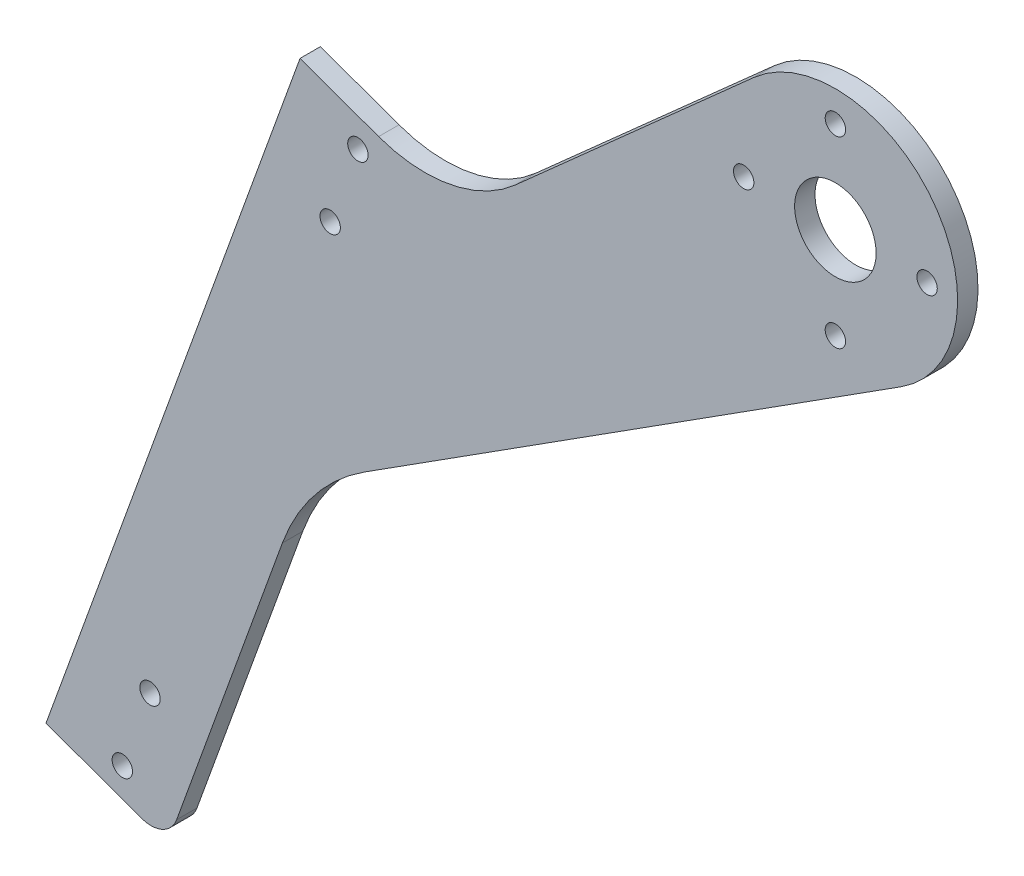
ISO-10303-21;
HEADER;
FILE_DESCRIPTION(('STEP AP214'),'2;1');
FILE_NAME('part.step','',(''),(''),'','','');
FILE_SCHEMA(('AUTOMOTIVE_DESIGN { 1 0 10303 214 1 1 1 1 }'));
ENDSEC;
DATA;
#1=APPLICATION_CONTEXT('core data for automotive mechanical design processes');
#2=APPLICATION_PROTOCOL_DEFINITION('international standard','automotive_design',2000,#1);
#3=PRODUCT_CONTEXT('',#1,'mechanical');
#4=PRODUCT('Part','Part','',(#3));
#5=PRODUCT_RELATED_PRODUCT_CATEGORY('part','',(#4));
#6=PRODUCT_DEFINITION_FORMATION('','',#4);
#7=PRODUCT_DEFINITION_CONTEXT('part definition',#1,'design');
#8=PRODUCT_DEFINITION('design','',#6,#7);
#9=PRODUCT_DEFINITION_SHAPE('','',#8);
#10=(LENGTH_UNIT() NAMED_UNIT(*) SI_UNIT(.MILLI.,.METRE.));
#11=(NAMED_UNIT(*) PLANE_ANGLE_UNIT() SI_UNIT($,.RADIAN.));
#12=(NAMED_UNIT(*) SI_UNIT($,.STERADIAN.) SOLID_ANGLE_UNIT());
#13=UNCERTAINTY_MEASURE_WITH_UNIT(LENGTH_MEASURE(1.E-05),#10,'distance_accuracy_value','');
#14=(GEOMETRIC_REPRESENTATION_CONTEXT(3) GLOBAL_UNCERTAINTY_ASSIGNED_CONTEXT((#13)) GLOBAL_UNIT_ASSIGNED_CONTEXT((#10,
#11,#12)) REPRESENTATION_CONTEXT('',''));
#15=CARTESIAN_POINT('',(0.,0.,0.));
#16=DIRECTION('',(0.,0.,1.));
#17=DIRECTION('',(1.,0.,0.));
#18=AXIS2_PLACEMENT_3D('',#15,#16,#17);
#19=CARTESIAN_POINT('',(2503.44317383467,1688.92255844548,3.));
#20=DIRECTION('',(0.,0.,-1.));
#21=DIRECTION('',(-1.,0.,0.));
#22=AXIS2_PLACEMENT_3D('',#19,#20,#21);
#23=CYLINDRICAL_SURFACE('',#22,29.9999999999998);
#24=CARTESIAN_POINT('',(2503.44317383467,1688.92255844548,0.));
#25=DIRECTION('',(0.,0.,1.));
#26=DIRECTION('',(1.,0.,0.));
#27=AXIS2_PLACEMENT_3D('',#24,#25,#26);
#28=CIRCLE('',#27,29.9999999999998);
#29=CARTESIAN_POINT('',(2487.3154468752,1714.21873252618,0.));
#30=VERTEX_POINT('',#29);
#31=CARTESIAN_POINT('',(2475.23009416642,1699.12168270361,0.));
#32=VERTEX_POINT('',#31);
#33=EDGE_CURVE('E169',#30,#32,#28,.T.);
#34=ORIENTED_EDGE('',*,*,#33,.F.);
#35=DIRECTION('',(0.,0.,-1.));
#36=VECTOR('',#35,1.);
#37=CARTESIAN_POINT('',(2487.3154468752,1714.21873252618,3.));
#38=LINE('',#37,#36);
#39=CARTESIAN_POINT('',(2487.3154468752,1714.21873252618,3.));
#40=VERTEX_POINT('',#39);
#41=EDGE_CURVE('E11',#40,#30,#38,.T.);
#42=ORIENTED_EDGE('',*,*,#41,.F.);
#43=CARTESIAN_POINT('',(2503.44317383467,1688.92255844548,3.));
#44=DIRECTION('',(0.,0.,1.));
#45=DIRECTION('',(1.,0.,0.));
#46=AXIS2_PLACEMENT_3D('',#43,#44,#45);
#47=CIRCLE('',#46,29.9999999999998);
#48=CARTESIAN_POINT('',(2475.23009416642,1699.12168270361,3.));
#49=VERTEX_POINT('',#48);
#50=EDGE_CURVE('E484',#40,#49,#47,.T.);
#51=ORIENTED_EDGE('',*,*,#50,.T.);
#52=DIRECTION('',(0.,0.,-1.));
#53=VECTOR('',#52,1.);
#54=CARTESIAN_POINT('',(2475.23009416642,1699.12168270361,3.));
#55=LINE('',#54,#53);
#56=EDGE_CURVE('E49',#49,#32,#55,.T.);
#57=ORIENTED_EDGE('',*,*,#56,.T.);
#58=EDGE_LOOP('',(#34,#42,#51,#57));
#59=FACE_BOUND('',#58,.T.);
#60=ADVANCED_FACE('F32',(#59),#23,.F.);
#61=CARTESIAN_POINT('',(-58.2108994697482,91.3031979076545,3.));
#62=DIRECTION('',(-0.537590898648854,0.8432058026899,0.));
#63=DIRECTION('',(-0.8432058026899,-0.537590898648854,0.));
#64=AXIS2_PLACEMENT_3D('',#61,#62,#63);
#65=PLANE('',#64);
#66=DIRECTION('',(0.8432058026899,0.537590898648854,0.));
#67=VECTOR('',#66,1.);
#68=CARTESIAN_POINT('',(-58.2108994697482,91.3031979076545,0.));
#69=LINE('',#68,#67);
#70=CARTESIAN_POINT('',(2566.31304572621,1764.58412377697,0.));
#71=VERTEX_POINT('',#70);
#72=EDGE_CURVE('E171',#30,#71,#69,.T.);
#73=ORIENTED_EDGE('',*,*,#72,.T.);
#74=DIRECTION('',(0.,0.,-1.));
#75=VECTOR('',#74,1.);
#76=CARTESIAN_POINT('',(2566.31304572621,1764.58412377697,3.));
#77=LINE('',#76,#75);
#78=CARTESIAN_POINT('',(2566.31304572621,1764.58412377697,3.));
#79=VERTEX_POINT('',#78);
#80=EDGE_CURVE('E41',#79,#71,#77,.T.);
#81=ORIENTED_EDGE('',*,*,#80,.F.);
#82=DIRECTION('',(0.8432058026899,0.537590898648854,0.));
#83=VECTOR('',#82,1.);
#84=CARTESIAN_POINT('',(-58.2108994697482,91.3031979076545,3.));
#85=LINE('',#84,#83);
#86=EDGE_CURVE('E482',#40,#79,#85,.T.);
#87=ORIENTED_EDGE('',*,*,#86,.F.);
#88=ORIENTED_EDGE('',*,*,#41,.T.);
#89=EDGE_LOOP('',(#73,#81,#87,#88));
#90=FACE_BOUND('',#89,.T.);
#91=ADVANCED_FACE('F227',(#90),#65,.F.);
#92=CARTESIAN_POINT('',(2556.63640955053,1779.76182822538,3.));
#93=DIRECTION('',(0.,0.,-1.));
#94=DIRECTION('',(-1.,0.,0.));
#95=AXIS2_PLACEMENT_3D('',#92,#93,#94);
#96=CYLINDRICAL_SURFACE('',#95,17.9999999999997);
#97=CARTESIAN_POINT('',(2556.63640955053,1779.76182822538,0.));
#98=DIRECTION('',(0.,0.,1.));
#99=DIRECTION('',(1.,0.,0.));
#100=AXIS2_PLACEMENT_3D('',#97,#98,#99);
#101=CIRCLE('',#100,17.9999999999997);
#102=CARTESIAN_POINT('',(2544.66757116968,1793.20604288497,0.));
#103=VERTEX_POINT('',#102);
#104=EDGE_CURVE('E174',#71,#103,#101,.T.);
#105=ORIENTED_EDGE('',*,*,#104,.T.);
#106=DIRECTION('',(0.,0.,-1.));
#107=VECTOR('',#106,1.);
#108=CARTESIAN_POINT('',(2544.66757116968,1793.20604288497,3.));
#109=LINE('',#108,#107);
#110=CARTESIAN_POINT('',(2544.66757116968,1793.20604288497,3.));
#111=VERTEX_POINT('',#110);
#112=EDGE_CURVE('E217',#111,#103,#109,.T.);
#113=ORIENTED_EDGE('',*,*,#112,.F.);
#114=CARTESIAN_POINT('',(2556.63640955053,1779.76182822538,3.));
#115=DIRECTION('',(0.,0.,1.));
#116=DIRECTION('',(1.,0.,0.));
#117=AXIS2_PLACEMENT_3D('',#114,#115,#116);
#118=CIRCLE('',#117,17.9999999999997);
#119=EDGE_CURVE('E223',#79,#111,#118,.T.);
#120=ORIENTED_EDGE('',*,*,#119,.F.);
#121=ORIENTED_EDGE('',*,*,#80,.T.);
#122=EDGE_LOOP('',(#105,#113,#120,#121));
#123=FACE_BOUND('',#122,.T.);
#124=ADVANCED_FACE('F221',(#123),#96,.T.);
#125=CARTESIAN_POINT('',(234.517859676913,-263.426436774984,3.));
#126=DIRECTION('',(-0.664935465602856,0.746900814421509,0.));
#127=DIRECTION('',(-0.746900814421509,-0.664935465602856,0.));
#128=AXIS2_PLACEMENT_3D('',#125,#126,#127);
#129=PLANE('',#128);
#130=DIRECTION('',(0.746900814421509,0.664935465602856,0.));
#131=VECTOR('',#130,1.);
#132=CARTESIAN_POINT('',(234.517859676913,-263.426436774984,0.));
#133=LINE('',#132,#131);
#134=CARTESIAN_POINT('',(2509.49964392501,1761.8974653266,0.));
#135=VERTEX_POINT('',#134);
#136=EDGE_CURVE('E177',#135,#103,#133,.T.);
#137=ORIENTED_EDGE('',*,*,#136,.F.);
#138=DIRECTION('',(0.,0.,-1.));
#139=VECTOR('',#138,1.);
#140=CARTESIAN_POINT('',(2509.49964392501,1761.8974653266,3.));
#141=LINE('',#140,#139);
#142=CARTESIAN_POINT('',(2509.49964392501,1761.8974653266,3.));
#143=VERTEX_POINT('',#142);
#144=EDGE_CURVE('E215',#143,#135,#141,.T.);
#145=ORIENTED_EDGE('',*,*,#144,.F.);
#146=DIRECTION('',(0.746900814421509,0.664935465602856,0.));
#147=VECTOR('',#146,1.);
#148=CARTESIAN_POINT('',(234.517859676913,-263.426436774984,3.));
#149=LINE('',#148,#147);
#150=EDGE_CURVE('E477',#143,#111,#149,.T.);
#151=ORIENTED_EDGE('',*,*,#150,.T.);
#152=ORIENTED_EDGE('',*,*,#112,.T.);
#153=EDGE_LOOP('',(#137,#145,#151,#152));
#154=FACE_BOUND('',#153,.T.);
#155=ADVANCED_FACE('F315',(#154),#129,.T.);
#156=CARTESIAN_POINT('',(2496.20093461295,1776.83548161503,3.));
#157=DIRECTION('',(0.,0.,-1.));
#158=DIRECTION('',(-1.,0.,0.));
#159=AXIS2_PLACEMENT_3D('',#156,#157,#158);
#160=CYLINDRICAL_SURFACE('',#159,19.9999999999999);
#161=CARTESIAN_POINT('',(2496.20093461295,1776.83548161503,0.));
#162=DIRECTION('',(0.,0.,1.));
#163=DIRECTION('',(1.,0.,0.));
#164=AXIS2_PLACEMENT_3D('',#161,#162,#163);
#165=CIRCLE('',#164,19.9999999999999);
#166=CARTESIAN_POINT('',(2489.40151844086,1758.0267618362,0.));
#167=VERTEX_POINT('',#166);
#168=EDGE_CURVE('E180',#167,#135,#165,.T.);
#169=ORIENTED_EDGE('',*,*,#168,.F.);
#170=DIRECTION('',(0.,0.,-1.));
#171=VECTOR('',#170,1.);
#172=CARTESIAN_POINT('',(2489.40151844086,1758.0267618362,3.));
#173=LINE('',#172,#171);
#174=CARTESIAN_POINT('',(2489.40151844086,1758.0267618362,3.));
#175=VERTEX_POINT('',#174);
#176=EDGE_CURVE('E213',#175,#167,#173,.T.);
#177=ORIENTED_EDGE('',*,*,#176,.F.);
#178=CARTESIAN_POINT('',(2496.20093461295,1776.83548161503,3.));
#179=DIRECTION('',(0.,0.,1.));
#180=DIRECTION('',(1.,0.,0.));
#181=AXIS2_PLACEMENT_3D('',#178,#179,#180);
#182=CIRCLE('',#181,19.9999999999999);
#183=EDGE_CURVE('E475',#175,#143,#182,.T.);
#184=ORIENTED_EDGE('',*,*,#183,.T.);
#185=ORIENTED_EDGE('',*,*,#144,.T.);
#186=EDGE_LOOP('',(#169,#177,#184,#185));
#187=FACE_BOUND('',#186,.T.);
#188=ADVANCED_FACE('F311',(#187),#160,.F.);
#189=CARTESIAN_POINT('',(849.803096548515,2350.74716793708,3.));
#190=DIRECTION('',(0.339970808604513,0.940435988941721,0.));
#191=DIRECTION('',(-0.940435988941721,0.339970808604513,0.));
#192=AXIS2_PLACEMENT_3D('',#189,#190,#191);
#193=PLANE('',#192);
#194=DIRECTION('',(0.940435988941721,-0.339970808604513,0.));
#195=VECTOR('',#194,1.);
#196=CARTESIAN_POINT('',(849.803096548515,2350.74716793708,0.));
#197=LINE('',#196,#195);
#198=CARTESIAN_POINT('',(2477.83292378821,1762.20884815013,0.));
#199=VERTEX_POINT('',#198);
#200=EDGE_CURVE('E183',#199,#167,#197,.T.);
#201=ORIENTED_EDGE('',*,*,#200,.F.);
#202=DIRECTION('',(0.,0.,-1.));
#203=VECTOR('',#202,1.);
#204=CARTESIAN_POINT('',(2477.83292378821,1762.20884815013,3.));
#205=LINE('',#204,#203);
#206=CARTESIAN_POINT('',(2477.83292378821,1762.20884815013,3.));
#207=VERTEX_POINT('',#206);
#208=EDGE_CURVE('E211',#207,#199,#205,.T.);
#209=ORIENTED_EDGE('',*,*,#208,.F.);
#210=DIRECTION('',(0.940435988941721,-0.339970808604513,0.));
#211=VECTOR('',#210,1.);
#212=CARTESIAN_POINT('',(849.803096548515,2350.74716793708,3.));
#213=LINE('',#212,#211);
#214=EDGE_CURVE('E137',#207,#175,#213,.T.);
#215=ORIENTED_EDGE('',*,*,#214,.T.);
#216=ORIENTED_EDGE('',*,*,#176,.T.);
#217=EDGE_LOOP('',(#201,#209,#215,#216));
#218=FACE_BOUND('',#217,.T.);
#219=ADVANCED_FACE('F307',(#218),#193,.T.);
#220=CARTESIAN_POINT('',(1628.02982723973,-588.538319786949,3.));
#221=DIRECTION('',(0.940435988941725,-0.339970808604503,0.));
#222=DIRECTION('',(0.339970808604503,0.940435988941725,0.));
#223=AXIS2_PLACEMENT_3D('',#220,#221,#222);
#224=PLANE('',#223);
#225=DIRECTION('',(-0.339970808604503,-0.940435988941725,0.));
#226=VECTOR('',#225,1.);
#227=CARTESIAN_POINT('',(1628.02982723973,-588.538319786949,0.));
#228=LINE('',#227,#226);
#229=CARTESIAN_POINT('',(2440.43613484172,1658.76088936654,0.));
#230=VERTEX_POINT('',#229);
#231=EDGE_CURVE('E186',#199,#230,#228,.T.);
#232=ORIENTED_EDGE('',*,*,#231,.T.);
#233=DIRECTION('',(0.,0.,-1.));
#234=VECTOR('',#233,1.);
#235=CARTESIAN_POINT('',(2440.43613484172,1658.76088936654,3.));
#236=LINE('',#235,#234);
#237=CARTESIAN_POINT('',(2440.43613484172,1658.76088936654,3.));
#238=VERTEX_POINT('',#237);
#239=EDGE_CURVE('E121',#238,#230,#236,.T.);
#240=ORIENTED_EDGE('',*,*,#239,.F.);
#241=DIRECTION('',(-0.339970808604503,-0.940435988941725,0.));
#242=VECTOR('',#241,1.);
#243=CARTESIAN_POINT('',(1628.02982723973,-588.538319786949,3.));
#244=LINE('',#243,#242);
#245=EDGE_CURVE('E134',#207,#238,#244,.T.);
#246=ORIENTED_EDGE('',*,*,#245,.F.);
#247=ORIENTED_EDGE('',*,*,#208,.T.);
#248=EDGE_LOOP('',(#232,#240,#246,#247));
#249=FACE_BOUND('',#248,.T.);
#250=ADVANCED_FACE('F304',(#249),#224,.F.);
#251=CARTESIAN_POINT('',(812.406307601934,2247.29920915347,3.));
#252=DIRECTION('',(-0.339970808604485,-0.940435988941731,0.));
#253=DIRECTION('',(0.940435988941732,-0.339970808604485,0.));
#254=AXIS2_PLACEMENT_3D('',#251,#252,#253);
#255=PLANE('',#254);
#256=DIRECTION('',(-0.940435988941732,0.339970808604485,0.));
#257=VECTOR('',#256,1.);
#258=CARTESIAN_POINT('',(812.406307601934,2247.29920915347,0.));
#259=LINE('',#258,#257);
#260=CARTESIAN_POINT('',(2454.54267467584,1653.66132723747,0.));
#261=VERTEX_POINT('',#260);
#262=EDGE_CURVE('E118',#261,#230,#259,.T.);
#263=ORIENTED_EDGE('',*,*,#262,.F.);
#264=DIRECTION('',(0.,0.,-1.));
#265=VECTOR('',#264,1.);
#266=CARTESIAN_POINT('',(2454.54267467584,1653.66132723747,3.));
#267=LINE('',#266,#265);
#268=CARTESIAN_POINT('',(2454.54267467584,1653.66132723747,3.));
#269=VERTEX_POINT('',#268);
#270=EDGE_CURVE('E112',#269,#261,#267,.T.);
#271=ORIENTED_EDGE('',*,*,#270,.F.);
#272=DIRECTION('',(-0.940435988941732,0.339970808604485,0.));
#273=VECTOR('',#272,1.);
#274=CARTESIAN_POINT('',(812.406307601934,2247.29920915347,3.));
#275=LINE('',#274,#273);
#276=EDGE_CURVE('E116',#269,#238,#275,.T.);
#277=ORIENTED_EDGE('',*,*,#276,.T.);
#278=ORIENTED_EDGE('',*,*,#239,.T.);
#279=EDGE_LOOP('',(#263,#271,#277,#278));
#280=FACE_BOUND('',#279,.T.);
#281=ADVANCED_FACE('F114',(#280),#255,.T.);
#282=CARTESIAN_POINT('',(2455.90255791026,1657.42307119324,3.));
#283=DIRECTION('',(0.,0.,-1.));
#284=DIRECTION('',(-1.,0.,0.));
#285=AXIS2_PLACEMENT_3D('',#282,#283,#284);
#286=CYLINDRICAL_SURFACE('',#285,4.00000000000004);
#287=CARTESIAN_POINT('',(2455.90255791026,1657.42307119324,0.));
#288=DIRECTION('',(0.,0.,1.));
#289=DIRECTION('',(1.,0.,0.));
#290=AXIS2_PLACEMENT_3D('',#287,#288,#289);
#291=CIRCLE('',#290,4.00000000000004);
#292=CARTESIAN_POINT('',(2459.66430186603,1656.06318795882,0.));
#293=VERTEX_POINT('',#292);
#294=EDGE_CURVE('E190',#261,#293,#291,.T.);
#295=ORIENTED_EDGE('',*,*,#294,.T.);
#296=DIRECTION('',(0.,0.,-1.));
#297=VECTOR('',#296,1.);
#298=CARTESIAN_POINT('',(2459.66430186603,1656.06318795882,3.));
#299=LINE('',#298,#297);
#300=CARTESIAN_POINT('',(2459.66430186603,1656.06318795882,3.));
#301=VERTEX_POINT('',#300);
#302=EDGE_CURVE('E81',#301,#293,#299,.T.);
#303=ORIENTED_EDGE('',*,*,#302,.F.);
#304=CARTESIAN_POINT('',(2455.90255791026,1657.42307119324,3.));
#305=DIRECTION('',(0.,0.,1.));
#306=DIRECTION('',(1.,0.,0.));
#307=AXIS2_PLACEMENT_3D('',#304,#305,#306);
#308=CIRCLE('',#307,4.00000000000004);
#309=EDGE_CURVE('E123',#269,#301,#308,.T.);
#310=ORIENTED_EDGE('',*,*,#309,.F.);
#311=ORIENTED_EDGE('',*,*,#270,.T.);
#312=EDGE_LOOP('',(#295,#303,#310,#311));
#313=FACE_BOUND('',#312,.T.);
#314=ADVANCED_FACE('F124',(#313),#286,.T.);
#315=CARTESIAN_POINT('',(2486.34761843768,1754.87741070401,3.));
#316=DIRECTION('',(0.,0.,-1.));
#317=DIRECTION('',(-1.,0.,0.));
#318=AXIS2_PLACEMENT_3D('',#315,#316,#317);
#319=CYLINDRICAL_SURFACE('',#318,1.50000000000006);
#320=CARTESIAN_POINT('',(2486.34761843768,1754.87741070401,3.));
#321=DIRECTION('',(0.,0.,1.));
#322=DIRECTION('',(1.,0.,0.));
#323=AXIS2_PLACEMENT_3D('',#320,#321,#322);
#324=CIRCLE('',#323,1.50000000000006);
#325=CARTESIAN_POINT('',(2487.84761843768,1754.87741070401,3.));
#326=VERTEX_POINT('',#325);
#327=EDGE_CURVE('E148',#326,#326,#324,.T.);
#328=ORIENTED_EDGE('',*,*,#327,.T.);
#329=EDGE_LOOP('',(#328));
#330=FACE_BOUND('',#329,.T.);
#331=CARTESIAN_POINT('',(2486.34761843768,1754.87741070401,0.));
#332=DIRECTION('',(0.,0.,1.));
#333=DIRECTION('',(1.,0.,0.));
#334=AXIS2_PLACEMENT_3D('',#331,#332,#333);
#335=CIRCLE('',#334,1.50000000000006);
#336=CARTESIAN_POINT('',(2487.84761843768,1754.87741070401,0.));
#337=VERTEX_POINT('',#336);
#338=EDGE_CURVE('E201',#337,#337,#335,.T.);
#339=ORIENTED_EDGE('',*,*,#338,.F.);
#340=EDGE_LOOP('',(#339));
#341=FACE_BOUND('',#340,.T.);
#342=ADVANCED_FACE('F286',(#330,#341),#319,.F.);
#343=CARTESIAN_POINT('',(2451.67059596002,1658.95293983196,3.));
#344=DIRECTION('',(0.,0.,-1.));
#345=DIRECTION('',(-1.,0.,0.));
#346=AXIS2_PLACEMENT_3D('',#343,#344,#345);
#347=CYLINDRICAL_SURFACE('',#346,1.50000000000006);
#348=CARTESIAN_POINT('',(2451.67059596002,1658.95293983196,3.));
#349=DIRECTION('',(0.,0.,1.));
#350=DIRECTION('',(1.,0.,0.));
#351=AXIS2_PLACEMENT_3D('',#348,#349,#350);
#352=CIRCLE('',#351,1.50000000000006);
#353=CARTESIAN_POINT('',(2453.17059596002,1658.95293983196,3.));
#354=VERTEX_POINT('',#353);
#355=EDGE_CURVE('E145',#354,#354,#352,.T.);
#356=ORIENTED_EDGE('',*,*,#355,.T.);
#357=EDGE_LOOP('',(#356));
#358=FACE_BOUND('',#357,.T.);
#359=CARTESIAN_POINT('',(2451.67059596002,1658.95293983196,0.));
#360=DIRECTION('',(0.,0.,1.));
#361=DIRECTION('',(1.,0.,0.));
#362=AXIS2_PLACEMENT_3D('',#359,#360,#361);
#363=CIRCLE('',#362,1.50000000000006);
#364=CARTESIAN_POINT('',(2453.17059596002,1658.95293983196,0.));
#365=VERTEX_POINT('',#364);
#366=EDGE_CURVE('E198',#365,#365,#363,.T.);
#367=ORIENTED_EDGE('',*,*,#366,.F.);
#368=EDGE_LOOP('',(#367));
#369=FACE_BOUND('',#368,.T.);
#370=ADVANCED_FACE('F289',(#358,#369),#347,.F.);
#371=CARTESIAN_POINT('',(2455.75024566328,1670.23817169926,3.));
#372=DIRECTION('',(0.,0.,-1.));
#373=DIRECTION('',(-1.,0.,0.));
#374=AXIS2_PLACEMENT_3D('',#371,#372,#373);
#375=CYLINDRICAL_SURFACE('',#374,1.50000000000006);
#376=CARTESIAN_POINT('',(2455.75024566328,1670.23817169926,3.));
#377=DIRECTION('',(0.,0.,1.));
#378=DIRECTION('',(1.,0.,0.));
#379=AXIS2_PLACEMENT_3D('',#376,#377,#378);
#380=CIRCLE('',#379,1.50000000000006);
#381=CARTESIAN_POINT('',(2457.25024566328,1670.23817169926,3.));
#382=VERTEX_POINT('',#381);
#383=EDGE_CURVE('E142',#382,#382,#380,.T.);
#384=ORIENTED_EDGE('',*,*,#383,.T.);
#385=EDGE_LOOP('',(#384));
#386=FACE_BOUND('',#385,.T.);
#387=CARTESIAN_POINT('',(2455.75024566328,1670.23817169926,0.));
#388=DIRECTION('',(0.,0.,1.));
#389=DIRECTION('',(1.,0.,0.));
#390=AXIS2_PLACEMENT_3D('',#387,#388,#389);
#391=CIRCLE('',#390,1.50000000000006);
#392=CARTESIAN_POINT('',(2457.25024566328,1670.23817169926,0.));
#393=VERTEX_POINT('',#392);
#394=EDGE_CURVE('E195',#393,#393,#391,.T.);
#395=ORIENTED_EDGE('',*,*,#394,.F.);
#396=EDGE_LOOP('',(#395));
#397=FACE_BOUND('',#396,.T.);
#398=ADVANCED_FACE('F293',(#386,#397),#375,.F.);
#399=CARTESIAN_POINT('',(1645.89811102961,-594.997765150437,3.));
#400=DIRECTION('',(0.940435988941724,-0.339970808604507,0.));
#401=DIRECTION('',(0.339970808604507,0.940435988941724,0.));
#402=AXIS2_PLACEMENT_3D('',#399,#400,#401);
#403=PLANE('',#402);
#404=DIRECTION('',(-0.339970808604507,-0.940435988941724,0.));
#405=VECTOR('',#404,1.);
#406=CARTESIAN_POINT('',(1645.89811102961,-594.997765150437,0.));
#407=LINE('',#406,#405);
#408=EDGE_CURVE('E192',#32,#293,#407,.T.);
#409=ORIENTED_EDGE('',*,*,#408,.F.);
#410=ORIENTED_EDGE('',*,*,#56,.F.);
#411=DIRECTION('',(-0.339970808604507,-0.940435988941724,0.));
#412=VECTOR('',#411,1.);
#413=CARTESIAN_POINT('',(1645.89811102961,-594.997765150437,3.));
#414=LINE('',#413,#412);
#415=EDGE_CURVE('E127',#49,#301,#414,.T.);
#416=ORIENTED_EDGE('',*,*,#415,.T.);
#417=ORIENTED_EDGE('',*,*,#302,.T.);
#418=EDGE_LOOP('',(#409,#410,#416,#417));
#419=FACE_BOUND('',#418,.T.);
#420=ADVANCED_FACE('F243',(#419),#403,.T.);
#421=CARTESIAN_POINT('',(2570.13640955054,1779.76182822539,3.));
#422=DIRECTION('',(0.,0.,-1.));
#423=DIRECTION('',(-1.,0.,0.));
#424=AXIS2_PLACEMENT_3D('',#421,#422,#423);
#425=CYLINDRICAL_SURFACE('',#424,1.50000000000006);
#426=CARTESIAN_POINT('',(2570.13640955054,1779.76182822539,3.));
#427=DIRECTION('',(0.,0.,1.));
#428=DIRECTION('',(1.,0.,0.));
#429=AXIS2_PLACEMENT_3D('',#426,#427,#428);
#430=CIRCLE('',#429,1.50000000000006);
#431=CARTESIAN_POINT('',(2571.63640955054,1779.76182822539,3.));
#432=VERTEX_POINT('',#431);
#433=EDGE_CURVE('E486',#432,#432,#430,.T.);
#434=ORIENTED_EDGE('',*,*,#433,.T.);
#435=EDGE_LOOP('',(#434));
#436=FACE_BOUND('',#435,.T.);
#437=CARTESIAN_POINT('',(2570.13640955054,1779.76182822539,0.));
#438=DIRECTION('',(0.,0.,1.));
#439=DIRECTION('',(1.,0.,0.));
#440=AXIS2_PLACEMENT_3D('',#437,#438,#439);
#441=CIRCLE('',#440,1.50000000000006);
#442=CARTESIAN_POINT('',(2571.63640955054,1779.76182822539,0.));
#443=VERTEX_POINT('',#442);
#444=EDGE_CURVE('E166',#443,#443,#441,.T.);
#445=ORIENTED_EDGE('',*,*,#444,.F.);
#446=EDGE_LOOP('',(#445));
#447=FACE_BOUND('',#446,.T.);
#448=ADVANCED_FACE('F239',(#436,#447),#425,.F.);
#449=CARTESIAN_POINT('',(2556.63640955054,1766.26182822539,3.));
#450=DIRECTION('',(0.,0.,-1.));
#451=DIRECTION('',(-1.,0.,0.));
#452=AXIS2_PLACEMENT_3D('',#449,#450,#451);
#453=CYLINDRICAL_SURFACE('',#452,1.50000000000006);
#454=CARTESIAN_POINT('',(2556.63640955054,1766.26182822539,3.));
#455=DIRECTION('',(0.,0.,1.));
#456=DIRECTION('',(1.,0.,0.));
#457=AXIS2_PLACEMENT_3D('',#454,#455,#456);
#458=CIRCLE('',#457,1.50000000000006);
#459=CARTESIAN_POINT('',(2558.13640955054,1766.26182822539,3.));
#460=VERTEX_POINT('',#459);
#461=EDGE_CURVE('E489',#460,#460,#458,.T.);
#462=ORIENTED_EDGE('',*,*,#461,.T.);
#463=EDGE_LOOP('',(#462));
#464=FACE_BOUND('',#463,.T.);
#465=CARTESIAN_POINT('',(2556.63640955054,1766.26182822539,0.));
#466=DIRECTION('',(0.,0.,1.));
#467=DIRECTION('',(1.,0.,0.));
#468=AXIS2_PLACEMENT_3D('',#465,#466,#467);
#469=CIRCLE('',#468,1.50000000000006);
#470=CARTESIAN_POINT('',(2558.13640955054,1766.26182822539,0.));
#471=VERTEX_POINT('',#470);
#472=EDGE_CURVE('E163',#471,#471,#469,.T.);
#473=ORIENTED_EDGE('',*,*,#472,.F.);
#474=EDGE_LOOP('',(#473));
#475=FACE_BOUND('',#474,.T.);
#476=ADVANCED_FACE('F242',(#464,#475),#453,.F.);
#477=CARTESIAN_POINT('',(2543.13640955054,1779.76182822539,3.));
#478=DIRECTION('',(0.,0.,-1.));
#479=DIRECTION('',(-1.,0.,0.));
#480=AXIS2_PLACEMENT_3D('',#477,#478,#479);
#481=CYLINDRICAL_SURFACE('',#480,1.50000000000006);
#482=CARTESIAN_POINT('',(2543.13640955054,1779.76182822539,3.));
#483=DIRECTION('',(0.,0.,1.));
#484=DIRECTION('',(1.,0.,0.));
#485=AXIS2_PLACEMENT_3D('',#482,#483,#484);
#486=CIRCLE('',#485,1.50000000000006);
#487=CARTESIAN_POINT('',(2544.63640955054,1779.76182822539,3.));
#488=VERTEX_POINT('',#487);
#489=EDGE_CURVE('E492',#488,#488,#486,.T.);
#490=ORIENTED_EDGE('',*,*,#489,.T.);
#491=EDGE_LOOP('',(#490));
#492=FACE_BOUND('',#491,.T.);
#493=CARTESIAN_POINT('',(2543.13640955054,1779.76182822539,0.));
#494=DIRECTION('',(0.,0.,1.));
#495=DIRECTION('',(1.,0.,0.));
#496=AXIS2_PLACEMENT_3D('',#493,#494,#495);
#497=CIRCLE('',#496,1.50000000000006);
#498=CARTESIAN_POINT('',(2544.63640955054,1779.76182822539,0.));
#499=VERTEX_POINT('',#498);
#500=EDGE_CURVE('E160',#499,#499,#497,.T.);
#501=ORIENTED_EDGE('',*,*,#500,.F.);
#502=EDGE_LOOP('',(#501));
#503=FACE_BOUND('',#502,.T.);
#504=ADVANCED_FACE('F247',(#492,#503),#481,.F.);
#505=CARTESIAN_POINT('',(2556.63640955054,1793.26182822539,3.));
#506=DIRECTION('',(0.,0.,-1.));
#507=DIRECTION('',(-1.,0.,0.));
#508=AXIS2_PLACEMENT_3D('',#505,#506,#507);
#509=CYLINDRICAL_SURFACE('',#508,1.50000000000006);
#510=CARTESIAN_POINT('',(2556.63640955054,1793.26182822539,3.));
#511=DIRECTION('',(0.,0.,1.));
#512=DIRECTION('',(1.,0.,0.));
#513=AXIS2_PLACEMENT_3D('',#510,#511,#512);
#514=CIRCLE('',#513,1.50000000000006);
#515=CARTESIAN_POINT('',(2558.13640955054,1793.26182822539,3.));
#516=VERTEX_POINT('',#515);
#517=EDGE_CURVE('E262',#516,#516,#514,.T.);
#518=ORIENTED_EDGE('',*,*,#517,.T.);
#519=EDGE_LOOP('',(#518));
#520=FACE_BOUND('',#519,.T.);
#521=CARTESIAN_POINT('',(2556.63640955054,1793.26182822539,0.));
#522=DIRECTION('',(0.,0.,1.));
#523=DIRECTION('',(1.,0.,0.));
#524=AXIS2_PLACEMENT_3D('',#521,#522,#523);
#525=CIRCLE('',#524,1.50000000000006);
#526=CARTESIAN_POINT('',(2558.13640955054,1793.26182822539,0.));
#527=VERTEX_POINT('',#526);
#528=EDGE_CURVE('E157',#527,#527,#525,.T.);
#529=ORIENTED_EDGE('',*,*,#528,.F.);
#530=EDGE_LOOP('',(#529));
#531=FACE_BOUND('',#530,.T.);
#532=ADVANCED_FACE('F250',(#520,#531),#509,.F.);
#533=CARTESIAN_POINT('',(2556.63640955053,1779.76182822538,3.));
#534=DIRECTION('',(0.,0.,-1.));
#535=DIRECTION('',(-1.,0.,0.));
#536=AXIS2_PLACEMENT_3D('',#533,#534,#535);
#537=CYLINDRICAL_SURFACE('',#536,6.00000000000245);
#538=CARTESIAN_POINT('',(2556.63640955053,1779.76182822538,3.));
#539=DIRECTION('',(0.,0.,1.));
#540=DIRECTION('',(1.,0.,0.));
#541=AXIS2_PLACEMENT_3D('',#538,#539,#540);
#542=CIRCLE('',#541,6.00000000000245);
#543=CARTESIAN_POINT('',(2562.63640955053,1779.76182822538,3.));
#544=VERTEX_POINT('',#543);
#545=EDGE_CURVE('E207',#544,#544,#542,.T.);
#546=ORIENTED_EDGE('',*,*,#545,.T.);
#547=EDGE_LOOP('',(#546));
#548=FACE_BOUND('',#547,.T.);
#549=CARTESIAN_POINT('',(2556.63640955053,1779.76182822538,0.));
#550=DIRECTION('',(0.,0.,1.));
#551=DIRECTION('',(1.,0.,0.));
#552=AXIS2_PLACEMENT_3D('',#549,#550,#551);
#553=CIRCLE('',#552,6.00000000000245);
#554=CARTESIAN_POINT('',(2562.63640955053,1779.76182822538,0.));
#555=VERTEX_POINT('',#554);
#556=EDGE_CURVE('E154',#555,#555,#553,.T.);
#557=ORIENTED_EDGE('',*,*,#556,.F.);
#558=EDGE_LOOP('',(#557));
#559=FACE_BOUND('',#558,.T.);
#560=ADVANCED_FACE('F34',(#548,#559),#537,.F.);
#561=CARTESIAN_POINT('',(2482.26796873443,1743.59217883671,3.));
#562=DIRECTION('',(0.,0.,-1.));
#563=DIRECTION('',(-1.,0.,0.));
#564=AXIS2_PLACEMENT_3D('',#561,#562,#563);
#565=CYLINDRICAL_SURFACE('',#564,1.50000000000006);
#566=CARTESIAN_POINT('',(2482.26796873443,1743.59217883671,3.));
#567=DIRECTION('',(0.,0.,1.));
#568=DIRECTION('',(1.,0.,0.));
#569=AXIS2_PLACEMENT_3D('',#566,#567,#568);
#570=CIRCLE('',#569,1.50000000000006);
#571=CARTESIAN_POINT('',(2483.76796873443,1743.59217883671,3.));
#572=VERTEX_POINT('',#571);
#573=EDGE_CURVE('E151',#572,#572,#570,.T.);
#574=ORIENTED_EDGE('',*,*,#573,.T.);
#575=EDGE_LOOP('',(#574));
#576=FACE_BOUND('',#575,.T.);
#577=CARTESIAN_POINT('',(2482.26796873443,1743.59217883671,0.));
#578=DIRECTION('',(0.,0.,1.));
#579=DIRECTION('',(1.,0.,0.));
#580=AXIS2_PLACEMENT_3D('',#577,#578,#579);
#581=CIRCLE('',#580,1.50000000000006);
#582=CARTESIAN_POINT('',(2483.76796873443,1743.59217883671,0.));
#583=VERTEX_POINT('',#582);
#584=EDGE_CURVE('E204',#583,#583,#581,.T.);
#585=ORIENTED_EDGE('',*,*,#584,.F.);
#586=EDGE_LOOP('',(#585));
#587=FACE_BOUND('',#586,.T.);
#588=ADVANCED_FACE('F257',(#576,#587),#565,.F.);
#589=CARTESIAN_POINT('',(0.,0.,3.));
#590=DIRECTION('',(0.,0.,1.));
#591=DIRECTION('',(1.,0.,0.));
#592=AXIS2_PLACEMENT_3D('',#589,#590,#591);
#593=PLANE('',#592);
#594=ORIENTED_EDGE('',*,*,#545,.F.);
#595=EDGE_LOOP('',(#594));
#596=FACE_BOUND('',#595,.T.);
#597=ORIENTED_EDGE('',*,*,#517,.F.);
#598=EDGE_LOOP('',(#597));
#599=FACE_BOUND('',#598,.T.);
#600=ORIENTED_EDGE('',*,*,#489,.F.);
#601=EDGE_LOOP('',(#600));
#602=FACE_BOUND('',#601,.T.);
#603=ORIENTED_EDGE('',*,*,#461,.F.);
#604=EDGE_LOOP('',(#603));
#605=FACE_BOUND('',#604,.T.);
#606=ORIENTED_EDGE('',*,*,#433,.F.);
#607=EDGE_LOOP('',(#606));
#608=FACE_BOUND('',#607,.T.);
#609=ORIENTED_EDGE('',*,*,#50,.F.);
#610=ORIENTED_EDGE('',*,*,#86,.T.);
#611=ORIENTED_EDGE('',*,*,#119,.T.);
#612=ORIENTED_EDGE('',*,*,#150,.F.);
#613=ORIENTED_EDGE('',*,*,#183,.F.);
#614=ORIENTED_EDGE('',*,*,#214,.F.);
#615=ORIENTED_EDGE('',*,*,#245,.T.);
#616=ORIENTED_EDGE('',*,*,#276,.F.);
#617=ORIENTED_EDGE('',*,*,#309,.T.);
#618=ORIENTED_EDGE('',*,*,#415,.F.);
#619=EDGE_LOOP('',(#609,#610,#611,#612,#613,#614,#615,#616,#617,#618));
#620=FACE_BOUND('',#619,.T.);
#621=ORIENTED_EDGE('',*,*,#383,.F.);
#622=EDGE_LOOP('',(#621));
#623=FACE_BOUND('',#622,.T.);
#624=ORIENTED_EDGE('',*,*,#355,.F.);
#625=EDGE_LOOP('',(#624));
#626=FACE_BOUND('',#625,.T.);
#627=ORIENTED_EDGE('',*,*,#327,.F.);
#628=EDGE_LOOP('',(#627));
#629=FACE_BOUND('',#628,.T.);
#630=ORIENTED_EDGE('',*,*,#573,.F.);
#631=EDGE_LOOP('',(#630));
#632=FACE_BOUND('',#631,.T.);
#633=ADVANCED_FACE('F130',(#596,#599,#602,#605,#608,#620,#623,#626,#629,#632),#593,.T.);
#634=CARTESIAN_POINT('',(0.,0.,0.));
#635=DIRECTION('',(0.,0.,1.));
#636=DIRECTION('',(1.,0.,0.));
#637=AXIS2_PLACEMENT_3D('',#634,#635,#636);
#638=PLANE('',#637);
#639=ORIENTED_EDGE('',*,*,#556,.T.);
#640=EDGE_LOOP('',(#639));
#641=FACE_BOUND('',#640,.T.);
#642=ORIENTED_EDGE('',*,*,#528,.T.);
#643=EDGE_LOOP('',(#642));
#644=FACE_BOUND('',#643,.T.);
#645=ORIENTED_EDGE('',*,*,#500,.T.);
#646=EDGE_LOOP('',(#645));
#647=FACE_BOUND('',#646,.T.);
#648=ORIENTED_EDGE('',*,*,#472,.T.);
#649=EDGE_LOOP('',(#648));
#650=FACE_BOUND('',#649,.T.);
#651=ORIENTED_EDGE('',*,*,#444,.T.);
#652=EDGE_LOOP('',(#651));
#653=FACE_BOUND('',#652,.T.);
#654=ORIENTED_EDGE('',*,*,#33,.T.);
#655=ORIENTED_EDGE('',*,*,#408,.T.);
#656=ORIENTED_EDGE('',*,*,#294,.F.);
#657=ORIENTED_EDGE('',*,*,#262,.T.);
#658=ORIENTED_EDGE('',*,*,#231,.F.);
#659=ORIENTED_EDGE('',*,*,#200,.T.);
#660=ORIENTED_EDGE('',*,*,#168,.T.);
#661=ORIENTED_EDGE('',*,*,#136,.T.);
#662=ORIENTED_EDGE('',*,*,#104,.F.);
#663=ORIENTED_EDGE('',*,*,#72,.F.);
#664=EDGE_LOOP('',(#654,#655,#656,#657,#658,#659,#660,#661,#662,#663));
#665=FACE_BOUND('',#664,.T.);
#666=ORIENTED_EDGE('',*,*,#394,.T.);
#667=EDGE_LOOP('',(#666));
#668=FACE_BOUND('',#667,.T.);
#669=ORIENTED_EDGE('',*,*,#366,.T.);
#670=EDGE_LOOP('',(#669));
#671=FACE_BOUND('',#670,.T.);
#672=ORIENTED_EDGE('',*,*,#338,.T.);
#673=EDGE_LOOP('',(#672));
#674=FACE_BOUND('',#673,.T.);
#675=ORIENTED_EDGE('',*,*,#584,.T.);
#676=EDGE_LOOP('',(#675));
#677=FACE_BOUND('',#676,.T.);
#678=ADVANCED_FACE('F229',(#641,#644,#647,#650,#653,#665,#668,#671,#674,#677),#638,.F.);
#679=CLOSED_SHELL('',(#60,#91,#124,#155,#188,#219,#250,#281,#314,#342,#370,#398,#420,#448,#476,
#504,#532,#560,#588,#633,#678));
#680=MANIFOLD_SOLID_BREP('B2',#679);
#681=ADVANCED_BREP_SHAPE_REPRESENTATION('',(#18,#680),#14);
#682=SHAPE_DEFINITION_REPRESENTATION(#9,#681);
ENDSEC;
END-ISO-10303-21;
